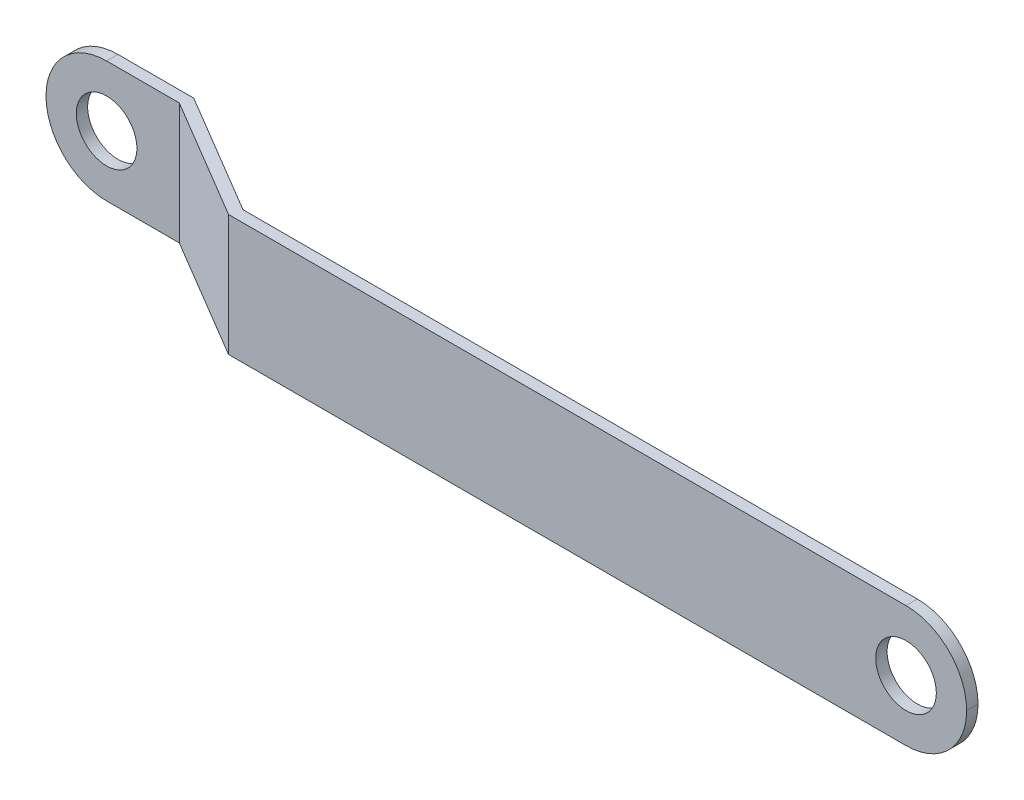
ISO-10303-21;
HEADER;
FILE_DESCRIPTION(('STEP AP214'),'2;1');
FILE_NAME('part.step','',(''),(''),'','','');
FILE_SCHEMA(('AUTOMOTIVE_DESIGN { 1 0 10303 214 1 1 1 1 }'));
ENDSEC;
DATA;
#1=APPLICATION_CONTEXT('core data for automotive mechanical design processes');
#2=APPLICATION_PROTOCOL_DEFINITION('international standard','automotive_design',2000,#1);
#3=PRODUCT_CONTEXT('',#1,'mechanical');
#4=PRODUCT('Part','Part','',(#3));
#5=PRODUCT_RELATED_PRODUCT_CATEGORY('part','',(#4));
#6=PRODUCT_DEFINITION_FORMATION('','',#4);
#7=PRODUCT_DEFINITION_CONTEXT('part definition',#1,'design');
#8=PRODUCT_DEFINITION('design','',#6,#7);
#9=PRODUCT_DEFINITION_SHAPE('','',#8);
#10=(LENGTH_UNIT() NAMED_UNIT(*) SI_UNIT(.MILLI.,.METRE.));
#11=(NAMED_UNIT(*) PLANE_ANGLE_UNIT() SI_UNIT($,.RADIAN.));
#12=(NAMED_UNIT(*) SI_UNIT($,.STERADIAN.) SOLID_ANGLE_UNIT());
#13=UNCERTAINTY_MEASURE_WITH_UNIT(LENGTH_MEASURE(1.E-05),#10,'distance_accuracy_value','');
#14=(GEOMETRIC_REPRESENTATION_CONTEXT(3) GLOBAL_UNCERTAINTY_ASSIGNED_CONTEXT((#13)) GLOBAL_UNIT_ASSIGNED_CONTEXT((#10,
#11,#12)) REPRESENTATION_CONTEXT('',''));
#15=CARTESIAN_POINT('',(0.,0.,0.));
#16=DIRECTION('',(0.,0.,1.));
#17=DIRECTION('',(1.,0.,0.));
#18=AXIS2_PLACEMENT_3D('',#15,#16,#17);
#19=CARTESIAN_POINT('',(34.,8.,11.));
#20=DIRECTION('',(0.,0.,-1.));
#21=DIRECTION('',(-1.,0.,0.));
#22=AXIS2_PLACEMENT_3D('',#19,#20,#21);
#23=PLANE('',#22);
#24=CARTESIAN_POINT('',(123.,0.,11.));
#25=DIRECTION('',(0.,0.,1.));
#26=DIRECTION('',(1.,0.,0.));
#27=AXIS2_PLACEMENT_3D('',#24,#25,#26);
#28=CIRCLE('',#27,3.99999999999999);
#29=CARTESIAN_POINT('',(127.,0.,11.));
#30=VERTEX_POINT('',#29);
#31=EDGE_CURVE('E241',#30,#30,#28,.T.);
#32=ORIENTED_EDGE('',*,*,#31,.F.);
#33=EDGE_LOOP('',(#32));
#34=FACE_BOUND('',#33,.T.);
#35=DIRECTION('',(1.,0.,0.));
#36=VECTOR('',#35,1.);
#37=CARTESIAN_POINT('',(34.,-8.,11.));
#38=LINE('',#37,#36);
#39=CARTESIAN_POINT('',(33.5882430422218,-8.,11.));
#40=VERTEX_POINT('',#39);
#41=CARTESIAN_POINT('',(123.,-8.,11.));
#42=VERTEX_POINT('',#41);
#43=EDGE_CURVE('E170',#40,#42,#38,.T.);
#44=ORIENTED_EDGE('',*,*,#43,.T.);
#45=CARTESIAN_POINT('',(123.,0.,11.));
#46=DIRECTION('',(0.,0.,-1.));
#47=DIRECTION('',(-1.,0.,0.));
#48=AXIS2_PLACEMENT_3D('',#45,#46,#47);
#49=CIRCLE('',#48,8.);
#50=CARTESIAN_POINT('',(131.,0.,11.));
#51=VERTEX_POINT('',#50);
#52=EDGE_CURVE('E202',#42,#51,#49,.F.);
#53=ORIENTED_EDGE('',*,*,#52,.T.);
#54=CARTESIAN_POINT('',(123.,0.,11.));
#55=DIRECTION('',(0.,0.,-1.));
#56=DIRECTION('',(-1.,0.,0.));
#57=AXIS2_PLACEMENT_3D('',#54,#55,#56);
#58=CIRCLE('',#57,8.);
#59=CARTESIAN_POINT('',(123.,8.,11.));
#60=VERTEX_POINT('',#59);
#61=EDGE_CURVE('E205',#51,#60,#58,.F.);
#62=ORIENTED_EDGE('',*,*,#61,.T.);
#63=DIRECTION('',(1.,0.,0.));
#64=VECTOR('',#63,1.);
#65=CARTESIAN_POINT('',(34.,8.,11.));
#66=LINE('',#65,#64);
#67=CARTESIAN_POINT('',(33.5882430422218,8.,11.));
#68=VERTEX_POINT('',#67);
#69=EDGE_CURVE('E146',#68,#60,#66,.T.);
#70=ORIENTED_EDGE('',*,*,#69,.F.);
#71=DIRECTION('',(0.,-1.,0.));
#72=VECTOR('',#71,1.);
#73=CARTESIAN_POINT('',(33.5882430422218,8.,11.));
#74=LINE('',#73,#72);
#75=EDGE_CURVE('E167',#68,#40,#74,.T.);
#76=ORIENTED_EDGE('',*,*,#75,.T.);
#77=EDGE_LOOP('',(#44,#53,#62,#70,#76));
#78=FACE_BOUND('',#77,.T.);
#79=ADVANCED_FACE('F44',(#34,#78),#23,.F.);
#80=CARTESIAN_POINT('',(34.,8.,9.5));
#81=DIRECTION('',(0.,0.,-1.));
#82=DIRECTION('',(-1.,0.,0.));
#83=AXIS2_PLACEMENT_3D('',#80,#81,#82);
#84=PLANE('',#83);
#85=CARTESIAN_POINT('',(123.,0.,9.5));
#86=DIRECTION('',(0.,0.,-1.));
#87=DIRECTION('',(-1.,0.,0.));
#88=AXIS2_PLACEMENT_3D('',#85,#86,#87);
#89=CIRCLE('',#88,3.99999999999999);
#90=CARTESIAN_POINT('',(119.,0.,9.5));
#91=VERTEX_POINT('',#90);
#92=EDGE_CURVE('E47',#91,#91,#89,.T.);
#93=ORIENTED_EDGE('',*,*,#92,.F.);
#94=EDGE_LOOP('',(#93));
#95=FACE_BOUND('',#94,.T.);
#96=CARTESIAN_POINT('',(123.,0.,9.5));
#97=DIRECTION('',(0.,0.,-1.));
#98=DIRECTION('',(-1.,0.,0.));
#99=AXIS2_PLACEMENT_3D('',#96,#97,#98);
#100=CIRCLE('',#99,8.);
#101=CARTESIAN_POINT('',(123.,8.,9.5));
#102=VERTEX_POINT('',#101);
#103=CARTESIAN_POINT('',(131.,0.,9.5));
#104=VERTEX_POINT('',#103);
#105=EDGE_CURVE('E208',#102,#104,#100,.T.);
#106=ORIENTED_EDGE('',*,*,#105,.T.);
#107=CARTESIAN_POINT('',(123.,0.,9.5));
#108=DIRECTION('',(0.,0.,-1.));
#109=DIRECTION('',(-1.,0.,0.));
#110=AXIS2_PLACEMENT_3D('',#107,#108,#109);
#111=CIRCLE('',#110,8.);
#112=CARTESIAN_POINT('',(123.,-8.,9.5));
#113=VERTEX_POINT('',#112);
#114=EDGE_CURVE('E211',#104,#113,#111,.T.);
#115=ORIENTED_EDGE('',*,*,#114,.T.);
#116=DIRECTION('',(1.,0.,0.));
#117=VECTOR('',#116,1.);
#118=CARTESIAN_POINT('',(34.,-8.,9.5));
#119=LINE('',#118,#117);
#120=CARTESIAN_POINT('',(34.,-8.,9.5));
#121=VERTEX_POINT('',#120);
#122=EDGE_CURVE('E128',#121,#113,#119,.T.);
#123=ORIENTED_EDGE('',*,*,#122,.F.);
#124=DIRECTION('',(0.,-1.,0.));
#125=VECTOR('',#124,1.);
#126=CARTESIAN_POINT('',(34.,8.,9.5));
#127=LINE('',#126,#125);
#128=CARTESIAN_POINT('',(34.,8.,9.5));
#129=VERTEX_POINT('',#128);
#130=EDGE_CURVE('E122',#129,#121,#127,.T.);
#131=ORIENTED_EDGE('',*,*,#130,.F.);
#132=DIRECTION('',(1.,0.,0.));
#133=VECTOR('',#132,1.);
#134=CARTESIAN_POINT('',(34.,8.,9.5));
#135=LINE('',#134,#133);
#136=EDGE_CURVE('E130',#129,#102,#135,.T.);
#137=ORIENTED_EDGE('',*,*,#136,.T.);
#138=EDGE_LOOP('',(#106,#115,#123,#131,#137));
#139=FACE_BOUND('',#138,.T.);
#140=ADVANCED_FACE('F127',(#95,#139),#84,.T.);
#141=CARTESIAN_POINT('',(18.,8.,0.));
#142=DIRECTION('',(0.510538754155436,0.,-0.859854743840735));
#143=DIRECTION('',(-0.859854743840735,0.,-0.510538754155436));
#144=AXIS2_PLACEMENT_3D('',#141,#142,#143);
#145=PLANE('',#144);
#146=DIRECTION('',(0.859854743840735,0.,0.510538754155436));
#147=VECTOR('',#146,1.);
#148=CARTESIAN_POINT('',(18.,-8.,0.));
#149=LINE('',#148,#147);
#150=CARTESIAN_POINT('',(18.,-8.,0.));
#151=VERTEX_POINT('',#150);
#152=EDGE_CURVE('E173',#151,#121,#149,.T.);
#153=ORIENTED_EDGE('',*,*,#152,.F.);
#154=DIRECTION('',(0.,-1.,0.));
#155=VECTOR('',#154,1.);
#156=CARTESIAN_POINT('',(18.,8.,0.));
#157=LINE('',#156,#155);
#158=CARTESIAN_POINT('',(18.,8.,0.));
#159=VERTEX_POINT('',#158);
#160=EDGE_CURVE('E140',#159,#151,#157,.T.);
#161=ORIENTED_EDGE('',*,*,#160,.F.);
#162=DIRECTION('',(0.859854743840735,0.,0.510538754155436));
#163=VECTOR('',#162,1.);
#164=CARTESIAN_POINT('',(18.,8.,0.));
#165=LINE('',#164,#163);
#166=EDGE_CURVE('E145',#159,#129,#165,.T.);
#167=ORIENTED_EDGE('',*,*,#166,.T.);
#168=ORIENTED_EDGE('',*,*,#130,.T.);
#169=EDGE_LOOP('',(#153,#161,#167,#168));
#170=FACE_BOUND('',#169,.T.);
#171=ADVANCED_FACE('F151',(#170),#145,.T.);
#172=CARTESIAN_POINT('',(0.,8.,0.));
#173=DIRECTION('',(0.,0.,-1.));
#174=DIRECTION('',(-1.,0.,0.));
#175=AXIS2_PLACEMENT_3D('',#172,#173,#174);
#176=PLANE('',#175);
#177=CARTESIAN_POINT('',(8.,0.,0.));
#178=DIRECTION('',(0.,0.,1.));
#179=DIRECTION('',(1.,0.,0.));
#180=AXIS2_PLACEMENT_3D('',#177,#178,#179);
#181=CIRCLE('',#180,4.);
#182=CARTESIAN_POINT('',(12.,0.,0.));
#183=VERTEX_POINT('',#182);
#184=EDGE_CURVE('E234',#183,#183,#181,.T.);
#185=ORIENTED_EDGE('',*,*,#184,.T.);
#186=EDGE_LOOP('',(#185));
#187=FACE_BOUND('',#186,.T.);
#188=DIRECTION('',(1.,0.,0.));
#189=VECTOR('',#188,1.);
#190=CARTESIAN_POINT('',(0.,-8.,0.));
#191=LINE('',#190,#189);
#192=CARTESIAN_POINT('',(8.,-8.,0.));
#193=VERTEX_POINT('',#192);
#194=EDGE_CURVE('E180',#193,#151,#191,.T.);
#195=ORIENTED_EDGE('',*,*,#194,.F.);
#196=CARTESIAN_POINT('',(8.,0.,0.));
#197=DIRECTION('',(0.,0.,-1.));
#198=DIRECTION('',(-1.,0.,0.));
#199=AXIS2_PLACEMENT_3D('',#196,#197,#198);
#200=CIRCLE('',#199,8.);
#201=CARTESIAN_POINT('',(0.,0.,0.));
#202=VERTEX_POINT('',#201);
#203=EDGE_CURVE('E67',#193,#202,#200,.T.);
#204=ORIENTED_EDGE('',*,*,#203,.T.);
#205=CARTESIAN_POINT('',(8.,0.,0.));
#206=DIRECTION('',(0.,0.,-1.));
#207=DIRECTION('',(-1.,0.,0.));
#208=AXIS2_PLACEMENT_3D('',#205,#206,#207);
#209=CIRCLE('',#208,8.);
#210=CARTESIAN_POINT('',(8.,8.,0.));
#211=VERTEX_POINT('',#210);
#212=EDGE_CURVE('E218',#202,#211,#209,.T.);
#213=ORIENTED_EDGE('',*,*,#212,.T.);
#214=DIRECTION('',(1.,0.,0.));
#215=VECTOR('',#214,1.);
#216=CARTESIAN_POINT('',(0.,8.,0.));
#217=LINE('',#216,#215);
#218=EDGE_CURVE('E152',#211,#159,#217,.T.);
#219=ORIENTED_EDGE('',*,*,#218,.T.);
#220=ORIENTED_EDGE('',*,*,#160,.T.);
#221=EDGE_LOOP('',(#195,#204,#213,#219,#220));
#222=FACE_BOUND('',#221,.T.);
#223=ADVANCED_FACE('F274',(#187,#222),#176,.T.);
#224=CARTESIAN_POINT('',(0.,8.,1.5));
#225=DIRECTION('',(0.,0.,-1.));
#226=DIRECTION('',(-1.,0.,0.));
#227=AXIS2_PLACEMENT_3D('',#224,#225,#226);
#228=PLANE('',#227);
#229=CARTESIAN_POINT('',(8.,0.,1.5));
#230=DIRECTION('',(0.,0.,-1.));
#231=DIRECTION('',(-1.,0.,0.));
#232=AXIS2_PLACEMENT_3D('',#229,#230,#231);
#233=CIRCLE('',#232,4.);
#234=CARTESIAN_POINT('',(4.,0.,1.5));
#235=VERTEX_POINT('',#234);
#236=EDGE_CURVE('E235',#235,#235,#233,.T.);
#237=ORIENTED_EDGE('',*,*,#236,.T.);
#238=EDGE_LOOP('',(#237));
#239=FACE_BOUND('',#238,.T.);
#240=CARTESIAN_POINT('',(8.,0.,1.5));
#241=DIRECTION('',(0.,0.,-1.));
#242=DIRECTION('',(-1.,0.,0.));
#243=AXIS2_PLACEMENT_3D('',#240,#241,#242);
#244=CIRCLE('',#243,8.);
#245=CARTESIAN_POINT('',(8.,8.,1.5));
#246=VERTEX_POINT('',#245);
#247=CARTESIAN_POINT('',(0.,0.,1.5));
#248=VERTEX_POINT('',#247);
#249=EDGE_CURVE('E54',#246,#248,#244,.F.);
#250=ORIENTED_EDGE('',*,*,#249,.T.);
#251=CARTESIAN_POINT('',(8.,0.,1.5));
#252=DIRECTION('',(0.,0.,-1.));
#253=DIRECTION('',(-1.,0.,0.));
#254=AXIS2_PLACEMENT_3D('',#251,#252,#253);
#255=CIRCLE('',#254,8.);
#256=CARTESIAN_POINT('',(8.,-8.,1.5));
#257=VERTEX_POINT('',#256);
#258=EDGE_CURVE('E11',#248,#257,#255,.F.);
#259=ORIENTED_EDGE('',*,*,#258,.T.);
#260=DIRECTION('',(1.,0.,0.));
#261=VECTOR('',#260,1.);
#262=CARTESIAN_POINT('',(0.,-8.,1.5));
#263=LINE('',#262,#261);
#264=CARTESIAN_POINT('',(17.5882430422218,-8.,1.5));
#265=VERTEX_POINT('',#264);
#266=EDGE_CURVE('E179',#257,#265,#263,.T.);
#267=ORIENTED_EDGE('',*,*,#266,.T.);
#268=DIRECTION('',(0.,-1.,0.));
#269=VECTOR('',#268,1.);
#270=CARTESIAN_POINT('',(17.5882430422218,8.,1.5));
#271=LINE('',#270,#269);
#272=CARTESIAN_POINT('',(17.5882430422218,8.,1.5));
#273=VERTEX_POINT('',#272);
#274=EDGE_CURVE('E188',#273,#265,#271,.T.);
#275=ORIENTED_EDGE('',*,*,#274,.F.);
#276=DIRECTION('',(1.,0.,0.));
#277=VECTOR('',#276,1.);
#278=CARTESIAN_POINT('',(0.,8.,1.5));
#279=LINE('',#278,#277);
#280=EDGE_CURVE('E160',#246,#273,#279,.T.);
#281=ORIENTED_EDGE('',*,*,#280,.F.);
#282=EDGE_LOOP('',(#250,#259,#267,#275,#281));
#283=FACE_BOUND('',#282,.T.);
#284=ADVANCED_FACE('F271',(#239,#283),#228,.F.);
#285=CARTESIAN_POINT('',(17.2341918687668,8.,1.2897821157611));
#286=DIRECTION('',(0.510538754155436,0.,-0.859854743840735));
#287=DIRECTION('',(-0.859854743840735,0.,-0.510538754155436));
#288=AXIS2_PLACEMENT_3D('',#285,#286,#287);
#289=PLANE('',#288);
#290=DIRECTION('',(0.859854743840735,0.,0.510538754155436));
#291=VECTOR('',#290,1.);
#292=CARTESIAN_POINT('',(17.2341918687668,-8.,1.2897821157611));
#293=LINE('',#292,#291);
#294=EDGE_CURVE('E181',#265,#40,#293,.T.);
#295=ORIENTED_EDGE('',*,*,#294,.T.);
#296=ORIENTED_EDGE('',*,*,#75,.F.);
#297=DIRECTION('',(0.859854743840735,0.,0.510538754155436));
#298=VECTOR('',#297,1.);
#299=CARTESIAN_POINT('',(17.2341918687668,8.,1.2897821157611));
#300=LINE('',#299,#298);
#301=EDGE_CURVE('E162',#273,#68,#300,.T.);
#302=ORIENTED_EDGE('',*,*,#301,.F.);
#303=ORIENTED_EDGE('',*,*,#274,.T.);
#304=EDGE_LOOP('',(#295,#296,#302,#303));
#305=FACE_BOUND('',#304,.T.);
#306=ADVANCED_FACE('F267',(#305),#289,.F.);
#307=CARTESIAN_POINT('',(0.,8.,0.));
#308=DIRECTION('',(0.,-1.,0.));
#309=DIRECTION('',(-1.,0.,0.));
#310=AXIS2_PLACEMENT_3D('',#307,#308,#309);
#311=PLANE('',#310);
#312=ORIENTED_EDGE('',*,*,#69,.T.);
#313=DIRECTION('',(0.,0.,1.));
#314=VECTOR('',#313,1.);
#315=CARTESIAN_POINT('',(123.,8.,9.5));
#316=LINE('',#315,#314);
#317=EDGE_CURVE('E148',#60,#102,#316,.F.);
#318=ORIENTED_EDGE('',*,*,#317,.T.);
#319=ORIENTED_EDGE('',*,*,#136,.F.);
#320=ORIENTED_EDGE('',*,*,#166,.F.);
#321=ORIENTED_EDGE('',*,*,#218,.F.);
#322=DIRECTION('',(0.,0.,-1.));
#323=VECTOR('',#322,1.);
#324=CARTESIAN_POINT('',(8.,8.,1.5));
#325=LINE('',#324,#323);
#326=EDGE_CURVE('E212',#211,#246,#325,.F.);
#327=ORIENTED_EDGE('',*,*,#326,.T.);
#328=ORIENTED_EDGE('',*,*,#280,.T.);
#329=ORIENTED_EDGE('',*,*,#301,.T.);
#330=EDGE_LOOP('',(#312,#318,#319,#320,#321,#327,#328,#329));
#331=FACE_BOUND('',#330,.T.);
#332=ADVANCED_FACE('F142',(#331),#311,.F.);
#333=CARTESIAN_POINT('',(0.,-8.,0.));
#334=DIRECTION('',(0.,-1.,0.));
#335=DIRECTION('',(-1.,0.,0.));
#336=AXIS2_PLACEMENT_3D('',#333,#334,#335);
#337=PLANE('',#336);
#338=ORIENTED_EDGE('',*,*,#122,.T.);
#339=DIRECTION('',(0.,0.,1.));
#340=VECTOR('',#339,1.);
#341=CARTESIAN_POINT('',(123.,-8.,0.));
#342=LINE('',#341,#340);
#343=EDGE_CURVE('E196',#113,#42,#342,.T.);
#344=ORIENTED_EDGE('',*,*,#343,.T.);
#345=ORIENTED_EDGE('',*,*,#43,.F.);
#346=ORIENTED_EDGE('',*,*,#294,.F.);
#347=ORIENTED_EDGE('',*,*,#266,.F.);
#348=DIRECTION('',(0.,0.,-1.));
#349=VECTOR('',#348,1.);
#350=CARTESIAN_POINT('',(8.,-8.,0.));
#351=LINE('',#350,#349);
#352=EDGE_CURVE('E138',#257,#193,#351,.T.);
#353=ORIENTED_EDGE('',*,*,#352,.T.);
#354=ORIENTED_EDGE('',*,*,#194,.T.);
#355=ORIENTED_EDGE('',*,*,#152,.T.);
#356=EDGE_LOOP('',(#338,#344,#345,#346,#347,#353,#354,#355));
#357=FACE_BOUND('',#356,.T.);
#358=ADVANCED_FACE('F265',(#357),#337,.T.);
#359=CARTESIAN_POINT('',(123.,0.,9.5));
#360=DIRECTION('',(0.,0.,-1.));
#361=DIRECTION('',(-1.,0.,0.));
#362=AXIS2_PLACEMENT_3D('',#359,#360,#361);
#363=CYLINDRICAL_SURFACE('',#362,8.);
#364=DIRECTION('',(0.,0.,1.));
#365=VECTOR('',#364,1.);
#366=CARTESIAN_POINT('',(131.,0.,11.));
#367=LINE('',#366,#365);
#368=EDGE_CURVE('E174',#104,#51,#367,.T.);
#369=ORIENTED_EDGE('',*,*,#368,.F.);
#370=ORIENTED_EDGE('',*,*,#105,.F.);
#371=ORIENTED_EDGE('',*,*,#317,.F.);
#372=ORIENTED_EDGE('',*,*,#61,.F.);
#373=EDGE_LOOP('',(#369,#370,#371,#372));
#374=FACE_BOUND('',#373,.T.);
#375=ADVANCED_FACE('F260',(#374),#363,.T.);
#376=CARTESIAN_POINT('',(123.,0.,0.));
#377=DIRECTION('',(0.,0.,1.));
#378=DIRECTION('',(1.,0.,0.));
#379=AXIS2_PLACEMENT_3D('',#376,#377,#378);
#380=CYLINDRICAL_SURFACE('',#379,8.);
#381=ORIENTED_EDGE('',*,*,#114,.F.);
#382=ORIENTED_EDGE('',*,*,#368,.T.);
#383=ORIENTED_EDGE('',*,*,#52,.F.);
#384=ORIENTED_EDGE('',*,*,#343,.F.);
#385=EDGE_LOOP('',(#381,#382,#383,#384));
#386=FACE_BOUND('',#385,.T.);
#387=ADVANCED_FACE('F262',(#386),#380,.T.);
#388=CARTESIAN_POINT('',(8.,0.,1.5));
#389=DIRECTION('',(0.,0.,1.));
#390=DIRECTION('',(1.,0.,0.));
#391=AXIS2_PLACEMENT_3D('',#388,#389,#390);
#392=CYLINDRICAL_SURFACE('',#391,8.);
#393=DIRECTION('',(0.,0.,-1.));
#394=VECTOR('',#393,1.);
#395=CARTESIAN_POINT('',(0.,0.,0.));
#396=LINE('',#395,#394);
#397=EDGE_CURVE('E228',#248,#202,#396,.T.);
#398=ORIENTED_EDGE('',*,*,#397,.F.);
#399=ORIENTED_EDGE('',*,*,#249,.F.);
#400=ORIENTED_EDGE('',*,*,#326,.F.);
#401=ORIENTED_EDGE('',*,*,#212,.F.);
#402=EDGE_LOOP('',(#398,#399,#400,#401));
#403=FACE_BOUND('',#402,.T.);
#404=ADVANCED_FACE('F50',(#403),#392,.T.);
#405=CARTESIAN_POINT('',(8.,0.,0.));
#406=DIRECTION('',(0.,0.,-1.));
#407=DIRECTION('',(-1.,0.,0.));
#408=AXIS2_PLACEMENT_3D('',#405,#406,#407);
#409=CYLINDRICAL_SURFACE('',#408,8.);
#410=ORIENTED_EDGE('',*,*,#258,.F.);
#411=ORIENTED_EDGE('',*,*,#397,.T.);
#412=ORIENTED_EDGE('',*,*,#203,.F.);
#413=ORIENTED_EDGE('',*,*,#352,.F.);
#414=EDGE_LOOP('',(#410,#411,#412,#413));
#415=FACE_BOUND('',#414,.T.);
#416=ADVANCED_FACE('F273',(#415),#409,.T.);
#417=CARTESIAN_POINT('',(8.,0.,0.));
#418=DIRECTION('',(0.,0.,1.));
#419=DIRECTION('',(1.,0.,0.));
#420=AXIS2_PLACEMENT_3D('',#417,#418,#419);
#421=CYLINDRICAL_SURFACE('',#420,4.);
#422=ORIENTED_EDGE('',*,*,#184,.F.);
#423=EDGE_LOOP('',(#422));
#424=FACE_BOUND('',#423,.T.);
#425=ORIENTED_EDGE('',*,*,#236,.F.);
#426=EDGE_LOOP('',(#425));
#427=FACE_BOUND('',#426,.T.);
#428=ADVANCED_FACE('F285',(#424,#427),#421,.F.);
#429=CARTESIAN_POINT('',(123.,0.,0.));
#430=DIRECTION('',(0.,0.,1.));
#431=DIRECTION('',(1.,0.,0.));
#432=AXIS2_PLACEMENT_3D('',#429,#430,#431);
#433=CYLINDRICAL_SURFACE('',#432,3.99999999999999);
#434=ORIENTED_EDGE('',*,*,#92,.T.);
#435=EDGE_LOOP('',(#434));
#436=FACE_BOUND('',#435,.T.);
#437=ORIENTED_EDGE('',*,*,#31,.T.);
#438=EDGE_LOOP('',(#437));
#439=FACE_BOUND('',#438,.T.);
#440=ADVANCED_FACE('F362',(#436,#439),#433,.F.);
#441=CLOSED_SHELL('',(#79,#140,#171,#223,#284,#306,#332,#358,#375,#387,#404,#416,#428,#440));
#442=MANIFOLD_SOLID_BREP('B2',#441);
#443=ADVANCED_BREP_SHAPE_REPRESENTATION('',(#18,#442),#14);
#444=SHAPE_DEFINITION_REPRESENTATION(#9,#443);
ENDSEC;
END-ISO-10303-21;
